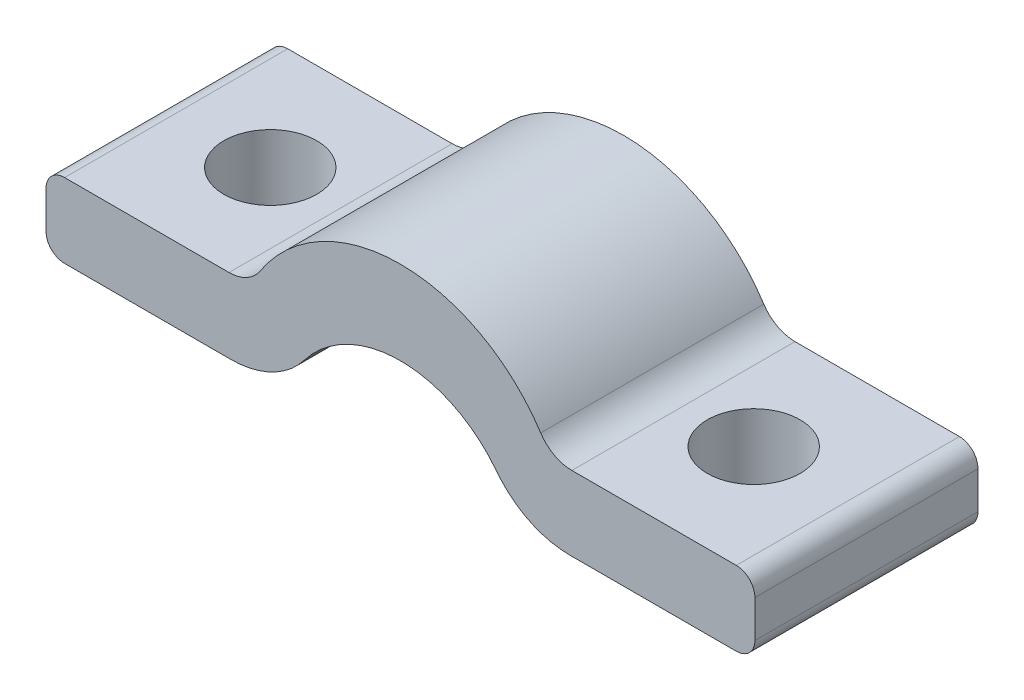
ISO-10303-21;
HEADER;
FILE_DESCRIPTION(('STEP AP214'),'2;1');
FILE_NAME('part.step','',(''),(''),'','','');
FILE_SCHEMA(('AUTOMOTIVE_DESIGN { 1 0 10303 214 1 1 1 1 }'));
ENDSEC;
DATA;
#1=APPLICATION_CONTEXT('core data for automotive mechanical design processes');
#2=APPLICATION_PROTOCOL_DEFINITION('international standard','automotive_design',2000,#1);
#3=PRODUCT_CONTEXT('',#1,'mechanical');
#4=PRODUCT('Part','Part','',(#3));
#5=PRODUCT_RELATED_PRODUCT_CATEGORY('part','',(#4));
#6=PRODUCT_DEFINITION_FORMATION('','',#4);
#7=PRODUCT_DEFINITION_CONTEXT('part definition',#1,'design');
#8=PRODUCT_DEFINITION('design','',#6,#7);
#9=PRODUCT_DEFINITION_SHAPE('','',#8);
#10=(LENGTH_UNIT() NAMED_UNIT(*) SI_UNIT(.MILLI.,.METRE.));
#11=(NAMED_UNIT(*) PLANE_ANGLE_UNIT() SI_UNIT($,.RADIAN.));
#12=(NAMED_UNIT(*) SI_UNIT($,.STERADIAN.) SOLID_ANGLE_UNIT());
#13=UNCERTAINTY_MEASURE_WITH_UNIT(LENGTH_MEASURE(1.E-05),#10,'distance_accuracy_value','');
#14=(GEOMETRIC_REPRESENTATION_CONTEXT(3) GLOBAL_UNCERTAINTY_ASSIGNED_CONTEXT((#13)) GLOBAL_UNIT_ASSIGNED_CONTEXT((#10,
#11,#12)) REPRESENTATION_CONTEXT('',''));
#15=CARTESIAN_POINT('',(0.,0.,0.));
#16=DIRECTION('',(0.,0.,1.));
#17=DIRECTION('',(1.,0.,0.));
#18=AXIS2_PLACEMENT_3D('',#15,#16,#17);
#19=CARTESIAN_POINT('',(0.,0.,6.));
#20=DIRECTION('',(0.,0.,-1.));
#21=DIRECTION('',(-1.,0.,0.));
#22=AXIS2_PLACEMENT_3D('',#19,#20,#21);
#23=CYLINDRICAL_SURFACE('',#22,3.25);
#24=CARTESIAN_POINT('',(0.,0.,0.));
#25=DIRECTION('',(0.,0.,-1.));
#26=DIRECTION('',(-1.,0.,0.));
#27=AXIS2_PLACEMENT_3D('',#24,#25,#26);
#28=CIRCLE('',#27,3.25);
#29=CARTESIAN_POINT('',(-2.57856237697424,1.97826086956522,0.));
#30=VERTEX_POINT('',#29);
#31=CARTESIAN_POINT('',(2.57856237697425,1.97826086956522,0.));
#32=VERTEX_POINT('',#31);
#33=EDGE_CURVE('E271',#30,#32,#28,.T.);
#34=ORIENTED_EDGE('',*,*,#33,.T.);
#35=DIRECTION('',(0.,0.,-1.));
#36=VECTOR('',#35,1.);
#37=CARTESIAN_POINT('',(2.57856237697425,1.97826086956522,6.));
#38=LINE('',#37,#36);
#39=CARTESIAN_POINT('',(2.57856237697425,1.97826086956522,6.));
#40=VERTEX_POINT('',#39);
#41=EDGE_CURVE('E55',#32,#40,#38,.F.);
#42=ORIENTED_EDGE('',*,*,#41,.T.);
#43=CARTESIAN_POINT('',(0.,0.,6.));
#44=DIRECTION('',(0.,0.,-1.));
#45=DIRECTION('',(-1.,0.,0.));
#46=AXIS2_PLACEMENT_3D('',#43,#44,#45);
#47=CIRCLE('',#46,3.25);
#48=CARTESIAN_POINT('',(-2.57856237697424,1.97826086956522,6.));
#49=VERTEX_POINT('',#48);
#50=EDGE_CURVE('E191',#49,#40,#47,.T.);
#51=ORIENTED_EDGE('',*,*,#50,.F.);
#52=DIRECTION('',(0.,0.,-1.));
#53=VECTOR('',#52,1.);
#54=CARTESIAN_POINT('',(-2.57856237697425,1.97826086956522,6.));
#55=LINE('',#54,#53);
#56=EDGE_CURVE('E251',#49,#30,#55,.T.);
#57=ORIENTED_EDGE('',*,*,#56,.T.);
#58=EDGE_LOOP('',(#34,#42,#51,#57));
#59=FACE_BOUND('',#58,.T.);
#60=ADVANCED_FACE('F34',(#59),#23,.F.);
#61=CARTESIAN_POINT('',(3.09232921921325,1.,6.));
#62=DIRECTION('',(0.,1.,0.));
#63=DIRECTION('',(0.,0.,1.));
#64=AXIS2_PLACEMENT_3D('',#61,#62,#63);
#65=PLANE('',#64);
#66=CARTESIAN_POINT('',(6.5,1.,3.));
#67=DIRECTION('',(0.,1.,0.));
#68=DIRECTION('',(0.,0.,1.));
#69=AXIS2_PLACEMENT_3D('',#66,#67,#68);
#70=CIRCLE('',#69,1.25);
#71=CARTESIAN_POINT('',(6.5,1.,4.25));
#72=VERTEX_POINT('',#71);
#73=EDGE_CURVE('E195',#72,#72,#70,.T.);
#74=ORIENTED_EDGE('',*,*,#73,.T.);
#75=EDGE_LOOP('',(#74));
#76=FACE_BOUND('',#75,.T.);
#77=DIRECTION('',(1.,0.,0.));
#78=VECTOR('',#77,1.);
#79=CARTESIAN_POINT('',(3.09232921921325,1.,6.));
#80=LINE('',#79,#78);
#81=CARTESIAN_POINT('',(4.56207189772366,1.,6.));
#82=VERTEX_POINT('',#81);
#83=CARTESIAN_POINT('',(9.03112887414927,1.,6.));
#84=VERTEX_POINT('',#83);
#85=EDGE_CURVE('E260',#82,#84,#80,.T.);
#86=ORIENTED_EDGE('',*,*,#85,.F.);
#87=DIRECTION('',(0.,0.,-1.));
#88=VECTOR('',#87,1.);
#89=CARTESIAN_POINT('',(4.56207189772366,1.,6.));
#90=LINE('',#89,#88);
#91=CARTESIAN_POINT('',(4.56207189772366,1.,0.));
#92=VERTEX_POINT('',#91);
#93=EDGE_CURVE('E244',#82,#92,#90,.T.);
#94=ORIENTED_EDGE('',*,*,#93,.T.);
#95=DIRECTION('',(1.,0.,0.));
#96=VECTOR('',#95,1.);
#97=CARTESIAN_POINT('',(3.09232921921325,1.,0.));
#98=LINE('',#97,#96);
#99=CARTESIAN_POINT('',(9.03112887414927,1.,0.));
#100=VERTEX_POINT('',#99);
#101=EDGE_CURVE('E272',#92,#100,#98,.T.);
#102=ORIENTED_EDGE('',*,*,#101,.T.);
#103=DIRECTION('',(0.,0.,-1.));
#104=VECTOR('',#103,1.);
#105=CARTESIAN_POINT('',(9.03112887414927,1.,6.));
#106=LINE('',#105,#104);
#107=EDGE_CURVE('E220',#100,#84,#106,.F.);
#108=ORIENTED_EDGE('',*,*,#107,.T.);
#109=EDGE_LOOP('',(#86,#94,#102,#108));
#110=FACE_BOUND('',#109,.T.);
#111=ADVANCED_FACE('F264',(#76,#110),#65,.F.);
#112=CARTESIAN_POINT('',(9.53112887414927,1.,6.));
#113=DIRECTION('',(-1.,0.,0.));
#114=DIRECTION('',(0.,0.,1.));
#115=AXIS2_PLACEMENT_3D('',#112,#113,#114);
#116=PLANE('',#115);
#117=DIRECTION('',(0.,1.,0.));
#118=VECTOR('',#117,1.);
#119=CARTESIAN_POINT('',(9.53112887414927,1.,6.));
#120=LINE('',#119,#118);
#121=CARTESIAN_POINT('',(9.53112887414927,1.5,6.));
#122=VERTEX_POINT('',#121);
#123=CARTESIAN_POINT('',(9.53112887414927,2.5,6.));
#124=VERTEX_POINT('',#123);
#125=EDGE_CURVE('E267',#122,#124,#120,.T.);
#126=ORIENTED_EDGE('',*,*,#125,.F.);
#127=DIRECTION('',(0.,0.,-1.));
#128=VECTOR('',#127,1.);
#129=CARTESIAN_POINT('',(9.53112887414927,1.5,6.));
#130=LINE('',#129,#128);
#131=CARTESIAN_POINT('',(9.53112887414927,1.5,0.));
#132=VERTEX_POINT('',#131);
#133=EDGE_CURVE('E208',#122,#132,#130,.T.);
#134=ORIENTED_EDGE('',*,*,#133,.T.);
#135=DIRECTION('',(0.,1.,0.));
#136=VECTOR('',#135,1.);
#137=CARTESIAN_POINT('',(9.53112887414927,1.,0.));
#138=LINE('',#137,#136);
#139=CARTESIAN_POINT('',(9.53112887414927,2.5,0.));
#140=VERTEX_POINT('',#139);
#141=EDGE_CURVE('E183',#132,#140,#138,.T.);
#142=ORIENTED_EDGE('',*,*,#141,.T.);
#143=DIRECTION('',(0.,0.,-1.));
#144=VECTOR('',#143,1.);
#145=CARTESIAN_POINT('',(9.53112887414927,2.5,6.));
#146=LINE('',#145,#144);
#147=EDGE_CURVE('E206',#140,#124,#146,.F.);
#148=ORIENTED_EDGE('',*,*,#147,.T.);
#149=EDGE_LOOP('',(#126,#134,#142,#148));
#150=FACE_BOUND('',#149,.T.);
#151=ADVANCED_FACE('F285',(#150),#116,.F.);
#152=CARTESIAN_POINT('',(9.53112887414927,3.,6.));
#153=DIRECTION('',(0.,-1.,0.));
#154=DIRECTION('',(1.,0.,0.));
#155=AXIS2_PLACEMENT_3D('',#152,#153,#154);
#156=PLANE('',#155);
#157=CARTESIAN_POINT('',(6.5,3.,3.));
#158=DIRECTION('',(0.,1.,0.));
#159=DIRECTION('',(0.,0.,1.));
#160=AXIS2_PLACEMENT_3D('',#157,#158,#159);
#161=CIRCLE('',#160,1.25);
#162=CARTESIAN_POINT('',(6.5,3.,4.25));
#163=VERTEX_POINT('',#162);
#164=EDGE_CURVE('E379',#163,#163,#161,.T.);
#165=ORIENTED_EDGE('',*,*,#164,.F.);
#166=EDGE_LOOP('',(#165));
#167=FACE_BOUND('',#166,.T.);
#168=DIRECTION('',(-1.,0.,0.));
#169=VECTOR('',#168,1.);
#170=CARTESIAN_POINT('',(9.53112887414927,3.,6.));
#171=LINE('',#170,#169);
#172=CARTESIAN_POINT('',(9.03112887414927,3.,6.));
#173=VERTEX_POINT('',#172);
#174=CARTESIAN_POINT('',(4.60977222864644,3.,6.));
#175=VERTEX_POINT('',#174);
#176=EDGE_CURVE('E293',#173,#175,#171,.T.);
#177=ORIENTED_EDGE('',*,*,#176,.F.);
#178=DIRECTION('',(0.,0.,-1.));
#179=VECTOR('',#178,1.);
#180=CARTESIAN_POINT('',(9.03112887414927,3.,6.));
#181=LINE('',#180,#179);
#182=CARTESIAN_POINT('',(9.03112887414927,3.,0.));
#183=VERTEX_POINT('',#182);
#184=EDGE_CURVE('E231',#173,#183,#181,.T.);
#185=ORIENTED_EDGE('',*,*,#184,.T.);
#186=DIRECTION('',(-1.,0.,0.));
#187=VECTOR('',#186,1.);
#188=CARTESIAN_POINT('',(9.53112887414927,3.,0.));
#189=LINE('',#188,#187);
#190=CARTESIAN_POINT('',(4.60977222864644,3.,0.));
#191=VERTEX_POINT('',#190);
#192=EDGE_CURVE('E178',#183,#191,#189,.T.);
#193=ORIENTED_EDGE('',*,*,#192,.T.);
#194=DIRECTION('',(0.,0.,1.));
#195=VECTOR('',#194,1.);
#196=CARTESIAN_POINT('',(4.60977222864644,3.,6.));
#197=LINE('',#196,#195);
#198=EDGE_CURVE('E156',#191,#175,#197,.T.);
#199=ORIENTED_EDGE('',*,*,#198,.T.);
#200=EDGE_LOOP('',(#177,#185,#193,#199));
#201=FACE_BOUND('',#200,.T.);
#202=ADVANCED_FACE('F295',(#167,#201),#156,.F.);
#203=CARTESIAN_POINT('',(0.,1.,6.));
#204=DIRECTION('',(0.,0.,-1.));
#205=DIRECTION('',(-1.,0.,0.));
#206=AXIS2_PLACEMENT_3D('',#203,#204,#205);
#207=CYLINDRICAL_SURFACE('',#206,4.5);
#208=CARTESIAN_POINT('',(0.,1.,6.));
#209=DIRECTION('',(0.,0.,1.));
#210=DIRECTION('',(-1.,0.,0.));
#211=AXIS2_PLACEMENT_3D('',#208,#209,#210);
#212=CIRCLE('',#211,4.5);
#213=CARTESIAN_POINT('',(3.771631823438,3.45454545454545,6.));
#214=VERTEX_POINT('',#213);
#215=CARTESIAN_POINT('',(-3.771631823438,3.45454545454545,6.));
#216=VERTEX_POINT('',#215);
#217=EDGE_CURVE('E170',#214,#216,#212,.T.);
#218=ORIENTED_EDGE('',*,*,#217,.F.);
#219=DIRECTION('',(0.,0.,-1.));
#220=VECTOR('',#219,1.);
#221=CARTESIAN_POINT('',(3.771631823438,3.45454545454545,6.));
#222=LINE('',#221,#220);
#223=CARTESIAN_POINT('',(3.771631823438,3.45454545454545,0.));
#224=VERTEX_POINT('',#223);
#225=EDGE_CURVE('E154',#214,#224,#222,.T.);
#226=ORIENTED_EDGE('',*,*,#225,.T.);
#227=CARTESIAN_POINT('',(0.,1.,0.));
#228=DIRECTION('',(0.,0.,1.));
#229=DIRECTION('',(-1.,0.,0.));
#230=AXIS2_PLACEMENT_3D('',#227,#228,#229);
#231=CIRCLE('',#230,4.5);
#232=CARTESIAN_POINT('',(-3.771631823438,3.45454545454545,0.));
#233=VERTEX_POINT('',#232);
#234=EDGE_CURVE('E167',#224,#233,#231,.T.);
#235=ORIENTED_EDGE('',*,*,#234,.T.);
#236=DIRECTION('',(0.,0.,-1.));
#237=VECTOR('',#236,1.);
#238=CARTESIAN_POINT('',(-3.771631823438,3.45454545454545,6.));
#239=LINE('',#238,#237);
#240=EDGE_CURVE('E171',#233,#216,#239,.F.);
#241=ORIENTED_EDGE('',*,*,#240,.T.);
#242=EDGE_LOOP('',(#218,#226,#235,#241));
#243=FACE_BOUND('',#242,.T.);
#244=ADVANCED_FACE('F166',(#243),#207,.T.);
#245=CARTESIAN_POINT('',(-9.53112887414927,3.,6.));
#246=DIRECTION('',(0.,-1.,0.));
#247=DIRECTION('',(0.,0.,-1.));
#248=AXIS2_PLACEMENT_3D('',#245,#246,#247);
#249=PLANE('',#248);
#250=CARTESIAN_POINT('',(-6.5,3.,3.));
#251=DIRECTION('',(0.,1.,0.));
#252=DIRECTION('',(0.,0.,1.));
#253=AXIS2_PLACEMENT_3D('',#250,#251,#252);
#254=CIRCLE('',#253,1.25);
#255=CARTESIAN_POINT('',(-6.5,3.,4.25));
#256=VERTEX_POINT('',#255);
#257=EDGE_CURVE('E196',#256,#256,#254,.T.);
#258=ORIENTED_EDGE('',*,*,#257,.F.);
#259=EDGE_LOOP('',(#258));
#260=FACE_BOUND('',#259,.T.);
#261=DIRECTION('',(-1.,0.,0.));
#262=VECTOR('',#261,1.);
#263=CARTESIAN_POINT('',(-9.53112887414927,3.,0.));
#264=LINE('',#263,#262);
#265=CARTESIAN_POINT('',(-4.60977222864644,3.,0.));
#266=VERTEX_POINT('',#265);
#267=CARTESIAN_POINT('',(-9.03112887414927,3.,0.));
#268=VERTEX_POINT('',#267);
#269=EDGE_CURVE('E177',#266,#268,#264,.T.);
#270=ORIENTED_EDGE('',*,*,#269,.T.);
#271=DIRECTION('',(0.,0.,-1.));
#272=VECTOR('',#271,1.);
#273=CARTESIAN_POINT('',(-9.03112887414927,3.,6.));
#274=LINE('',#273,#272);
#275=CARTESIAN_POINT('',(-9.03112887414927,3.,6.));
#276=VERTEX_POINT('',#275);
#277=EDGE_CURVE('E242',#268,#276,#274,.F.);
#278=ORIENTED_EDGE('',*,*,#277,.T.);
#279=DIRECTION('',(-1.,0.,0.));
#280=VECTOR('',#279,1.);
#281=CARTESIAN_POINT('',(-9.53112887414927,3.,6.));
#282=LINE('',#281,#280);
#283=CARTESIAN_POINT('',(-4.60977222864644,3.,6.));
#284=VERTEX_POINT('',#283);
#285=EDGE_CURVE('E297',#284,#276,#282,.T.);
#286=ORIENTED_EDGE('',*,*,#285,.F.);
#287=DIRECTION('',(0.,0.,1.));
#288=VECTOR('',#287,1.);
#289=CARTESIAN_POINT('',(-4.60977222864644,3.,0.));
#290=LINE('',#289,#288);
#291=EDGE_CURVE('E161',#284,#266,#290,.F.);
#292=ORIENTED_EDGE('',*,*,#291,.T.);
#293=EDGE_LOOP('',(#270,#278,#286,#292));
#294=FACE_BOUND('',#293,.T.);
#295=ADVANCED_FACE('F323',(#260,#294),#249,.F.);
#296=CARTESIAN_POINT('',(-9.53112887414927,0.999999999999998,6.));
#297=DIRECTION('',(1.,0.,0.));
#298=DIRECTION('',(0.,0.,-1.));
#299=AXIS2_PLACEMENT_3D('',#296,#297,#298);
#300=PLANE('',#299);
#301=DIRECTION('',(0.,-1.,0.));
#302=VECTOR('',#301,1.);
#303=CARTESIAN_POINT('',(-9.53112887414927,0.999999999999998,0.));
#304=LINE('',#303,#302);
#305=CARTESIAN_POINT('',(-9.53112887414927,2.5,0.));
#306=VERTEX_POINT('',#305);
#307=CARTESIAN_POINT('',(-9.53112887414927,1.5,0.));
#308=VERTEX_POINT('',#307);
#309=EDGE_CURVE('E181',#306,#308,#304,.T.);
#310=ORIENTED_EDGE('',*,*,#309,.T.);
#311=DIRECTION('',(0.,0.,-1.));
#312=VECTOR('',#311,1.);
#313=CARTESIAN_POINT('',(-9.53112887414927,1.5,6.));
#314=LINE('',#313,#312);
#315=CARTESIAN_POINT('',(-9.53112887414927,1.5,6.));
#316=VERTEX_POINT('',#315);
#317=EDGE_CURVE('E240',#308,#316,#314,.F.);
#318=ORIENTED_EDGE('',*,*,#317,.T.);
#319=DIRECTION('',(0.,-1.,0.));
#320=VECTOR('',#319,1.);
#321=CARTESIAN_POINT('',(-9.53112887414927,0.999999999999998,6.));
#322=LINE('',#321,#320);
#323=CARTESIAN_POINT('',(-9.53112887414927,2.5,6.));
#324=VERTEX_POINT('',#323);
#325=EDGE_CURVE('E302',#324,#316,#322,.T.);
#326=ORIENTED_EDGE('',*,*,#325,.F.);
#327=DIRECTION('',(0.,0.,-1.));
#328=VECTOR('',#327,1.);
#329=CARTESIAN_POINT('',(-9.53112887414927,2.5,6.));
#330=LINE('',#329,#328);
#331=EDGE_CURVE('E237',#324,#306,#330,.T.);
#332=ORIENTED_EDGE('',*,*,#331,.T.);
#333=EDGE_LOOP('',(#310,#318,#326,#332));
#334=FACE_BOUND('',#333,.T.);
#335=ADVANCED_FACE('F316',(#334),#300,.F.);
#336=CARTESIAN_POINT('',(-3.09232921921325,1.,6.));
#337=DIRECTION('',(0.,1.,0.));
#338=DIRECTION('',(-1.,0.,0.));
#339=AXIS2_PLACEMENT_3D('',#336,#337,#338);
#340=PLANE('',#339);
#341=CARTESIAN_POINT('',(-6.5,0.999999999999998,3.));
#342=DIRECTION('',(0.,1.,0.));
#343=DIRECTION('',(-1.,0.,0.));
#344=AXIS2_PLACEMENT_3D('',#341,#342,#343);
#345=CIRCLE('',#344,1.25);
#346=CARTESIAN_POINT('',(-7.75,0.999999999999998,3.));
#347=VERTEX_POINT('',#346);
#348=EDGE_CURVE('E192',#347,#347,#345,.T.);
#349=ORIENTED_EDGE('',*,*,#348,.T.);
#350=EDGE_LOOP('',(#349));
#351=FACE_BOUND('',#350,.T.);
#352=DIRECTION('',(1.,0.,0.));
#353=VECTOR('',#352,1.);
#354=CARTESIAN_POINT('',(-3.09232921921325,1.,0.));
#355=LINE('',#354,#353);
#356=CARTESIAN_POINT('',(-9.03112887414927,0.999999999999999,0.));
#357=VERTEX_POINT('',#356);
#358=CARTESIAN_POINT('',(-4.56207189772366,1.,0.));
#359=VERTEX_POINT('',#358);
#360=EDGE_CURVE('E189',#357,#359,#355,.T.);
#361=ORIENTED_EDGE('',*,*,#360,.T.);
#362=DIRECTION('',(0.,0.,-1.));
#363=VECTOR('',#362,1.);
#364=CARTESIAN_POINT('',(-4.56207189772366,1.,6.));
#365=LINE('',#364,#363);
#366=CARTESIAN_POINT('',(-4.56207189772366,1.,6.));
#367=VERTEX_POINT('',#366);
#368=EDGE_CURVE('E11',#359,#367,#365,.F.);
#369=ORIENTED_EDGE('',*,*,#368,.T.);
#370=DIRECTION('',(1.,0.,0.));
#371=VECTOR('',#370,1.);
#372=CARTESIAN_POINT('',(-3.09232921921325,1.,6.));
#373=LINE('',#372,#371);
#374=CARTESIAN_POINT('',(-9.03112887414927,0.999999999999999,6.));
#375=VERTEX_POINT('',#374);
#376=EDGE_CURVE('E197',#375,#367,#373,.T.);
#377=ORIENTED_EDGE('',*,*,#376,.F.);
#378=DIRECTION('',(0.,0.,-1.));
#379=VECTOR('',#378,1.);
#380=CARTESIAN_POINT('',(-9.03112887414927,0.999999999999999,6.));
#381=LINE('',#380,#379);
#382=EDGE_CURVE('E234',#375,#357,#381,.T.);
#383=ORIENTED_EDGE('',*,*,#382,.T.);
#384=EDGE_LOOP('',(#361,#369,#377,#383));
#385=FACE_BOUND('',#384,.T.);
#386=ADVANCED_FACE('F310',(#351,#385),#340,.F.);
#387=CARTESIAN_POINT('',(0.,0.,6.));
#388=DIRECTION('',(0.,0.,-1.));
#389=DIRECTION('',(-1.,0.,0.));
#390=AXIS2_PLACEMENT_3D('',#387,#388,#389);
#391=PLANE('',#390);
#392=ORIENTED_EDGE('',*,*,#50,.T.);
#393=CARTESIAN_POINT('',(4.56207189772366,3.5,6.));
#394=DIRECTION('',(0.,0.,-1.));
#395=DIRECTION('',(-1.,0.,0.));
#396=AXIS2_PLACEMENT_3D('',#393,#394,#395);
#397=CIRCLE('',#396,2.5);
#398=EDGE_CURVE('E42',#40,#82,#397,.F.);
#399=ORIENTED_EDGE('',*,*,#398,.T.);
#400=ORIENTED_EDGE('',*,*,#85,.T.);
#401=CARTESIAN_POINT('',(9.03112887414927,1.5,6.));
#402=DIRECTION('',(0.,0.,-1.));
#403=DIRECTION('',(-1.,0.,0.));
#404=AXIS2_PLACEMENT_3D('',#401,#402,#403);
#405=CIRCLE('',#404,0.5);
#406=EDGE_CURVE('E229',#84,#122,#405,.F.);
#407=ORIENTED_EDGE('',*,*,#406,.T.);
#408=ORIENTED_EDGE('',*,*,#125,.T.);
#409=CARTESIAN_POINT('',(9.03112887414927,2.5,6.));
#410=DIRECTION('',(0.,0.,-1.));
#411=DIRECTION('',(-1.,0.,0.));
#412=AXIS2_PLACEMENT_3D('',#409,#410,#411);
#413=CIRCLE('',#412,0.5);
#414=EDGE_CURVE('E227',#124,#173,#413,.F.);
#415=ORIENTED_EDGE('',*,*,#414,.T.);
#416=ORIENTED_EDGE('',*,*,#176,.T.);
#417=CARTESIAN_POINT('',(4.60977222864644,4.,6.));
#418=DIRECTION('',(0.,0.,-1.));
#419=DIRECTION('',(-1.,0.,0.));
#420=AXIS2_PLACEMENT_3D('',#417,#418,#419);
#421=CIRCLE('',#420,1.);
#422=EDGE_CURVE('E160',#175,#214,#421,.T.);
#423=ORIENTED_EDGE('',*,*,#422,.T.);
#424=ORIENTED_EDGE('',*,*,#217,.T.);
#425=CARTESIAN_POINT('',(-4.60977222864644,4.,6.));
#426=DIRECTION('',(0.,0.,-1.));
#427=DIRECTION('',(-1.,0.,0.));
#428=AXIS2_PLACEMENT_3D('',#425,#426,#427);
#429=CIRCLE('',#428,1.);
#430=EDGE_CURVE('E204',#216,#284,#429,.T.);
#431=ORIENTED_EDGE('',*,*,#430,.T.);
#432=ORIENTED_EDGE('',*,*,#285,.T.);
#433=CARTESIAN_POINT('',(-9.03112887414927,2.5,6.));
#434=DIRECTION('',(0.,0.,-1.));
#435=DIRECTION('',(-1.,0.,0.));
#436=AXIS2_PLACEMENT_3D('',#433,#434,#435);
#437=CIRCLE('',#436,0.5);
#438=EDGE_CURVE('E223',#276,#324,#437,.F.);
#439=ORIENTED_EDGE('',*,*,#438,.T.);
#440=ORIENTED_EDGE('',*,*,#325,.T.);
#441=CARTESIAN_POINT('',(-9.03112887414927,1.5,6.));
#442=DIRECTION('',(0.,0.,-1.));
#443=DIRECTION('',(-1.,0.,0.));
#444=AXIS2_PLACEMENT_3D('',#441,#442,#443);
#445=CIRCLE('',#444,0.5);
#446=EDGE_CURVE('E225',#316,#375,#445,.F.);
#447=ORIENTED_EDGE('',*,*,#446,.T.);
#448=ORIENTED_EDGE('',*,*,#376,.T.);
#449=CARTESIAN_POINT('',(-4.56207189772366,3.5,6.));
#450=DIRECTION('',(0.,0.,-1.));
#451=DIRECTION('',(-1.,0.,0.));
#452=AXIS2_PLACEMENT_3D('',#449,#450,#451);
#453=CIRCLE('',#452,2.5);
#454=EDGE_CURVE('E255',#367,#49,#453,.F.);
#455=ORIENTED_EDGE('',*,*,#454,.T.);
#456=EDGE_LOOP('',(#392,#399,#400,#407,#408,#415,#416,#423,#424,#431,#432,#439,#440,#447,#448,#455));
#457=FACE_BOUND('',#456,.T.);
#458=ADVANCED_FACE('F259',(#457),#391,.F.);
#459=CARTESIAN_POINT('',(0.,0.,0.));
#460=DIRECTION('',(0.,0.,-1.));
#461=DIRECTION('',(-1.,0.,0.));
#462=AXIS2_PLACEMENT_3D('',#459,#460,#461);
#463=PLANE('',#462);
#464=ORIENTED_EDGE('',*,*,#101,.F.);
#465=CARTESIAN_POINT('',(4.56207189772366,3.5,0.));
#466=DIRECTION('',(0.,0.,-1.));
#467=DIRECTION('',(-1.,0.,0.));
#468=AXIS2_PLACEMENT_3D('',#465,#466,#467);
#469=CIRCLE('',#468,2.5);
#470=EDGE_CURVE('E249',#92,#32,#469,.T.);
#471=ORIENTED_EDGE('',*,*,#470,.T.);
#472=ORIENTED_EDGE('',*,*,#33,.F.);
#473=CARTESIAN_POINT('',(-4.56207189772366,3.5,0.));
#474=DIRECTION('',(0.,0.,-1.));
#475=DIRECTION('',(-1.,0.,0.));
#476=AXIS2_PLACEMENT_3D('',#473,#474,#475);
#477=CIRCLE('',#476,2.5);
#478=EDGE_CURVE('E247',#30,#359,#477,.T.);
#479=ORIENTED_EDGE('',*,*,#478,.T.);
#480=ORIENTED_EDGE('',*,*,#360,.F.);
#481=CARTESIAN_POINT('',(-9.03112887414927,1.5,0.));
#482=DIRECTION('',(0.,0.,-1.));
#483=DIRECTION('',(-1.,0.,0.));
#484=AXIS2_PLACEMENT_3D('',#481,#482,#483);
#485=CIRCLE('',#484,0.5);
#486=EDGE_CURVE('E213',#357,#308,#485,.T.);
#487=ORIENTED_EDGE('',*,*,#486,.T.);
#488=ORIENTED_EDGE('',*,*,#309,.F.);
#489=CARTESIAN_POINT('',(-9.03112887414927,2.5,0.));
#490=DIRECTION('',(0.,0.,-1.));
#491=DIRECTION('',(-1.,0.,0.));
#492=AXIS2_PLACEMENT_3D('',#489,#490,#491);
#493=CIRCLE('',#492,0.5);
#494=EDGE_CURVE('E211',#306,#268,#493,.T.);
#495=ORIENTED_EDGE('',*,*,#494,.T.);
#496=ORIENTED_EDGE('',*,*,#269,.F.);
#497=CARTESIAN_POINT('',(-4.60977222864644,4.,0.));
#498=DIRECTION('',(0.,0.,-1.));
#499=DIRECTION('',(-1.,0.,0.));
#500=AXIS2_PLACEMENT_3D('',#497,#498,#499);
#501=CIRCLE('',#500,1.);
#502=EDGE_CURVE('E176',#266,#233,#501,.F.);
#503=ORIENTED_EDGE('',*,*,#502,.T.);
#504=ORIENTED_EDGE('',*,*,#234,.F.);
#505=CARTESIAN_POINT('',(4.60977222864644,4.,0.));
#506=DIRECTION('',(0.,0.,-1.));
#507=DIRECTION('',(-1.,0.,0.));
#508=AXIS2_PLACEMENT_3D('',#505,#506,#507);
#509=CIRCLE('',#508,1.);
#510=EDGE_CURVE('E150',#224,#191,#509,.F.);
#511=ORIENTED_EDGE('',*,*,#510,.T.);
#512=ORIENTED_EDGE('',*,*,#192,.F.);
#513=CARTESIAN_POINT('',(9.03112887414927,2.5,0.));
#514=DIRECTION('',(0.,0.,-1.));
#515=DIRECTION('',(-1.,0.,0.));
#516=AXIS2_PLACEMENT_3D('',#513,#514,#515);
#517=CIRCLE('',#516,0.5);
#518=EDGE_CURVE('E215',#183,#140,#517,.T.);
#519=ORIENTED_EDGE('',*,*,#518,.T.);
#520=ORIENTED_EDGE('',*,*,#141,.F.);
#521=CARTESIAN_POINT('',(9.03112887414927,1.5,0.));
#522=DIRECTION('',(0.,0.,-1.));
#523=DIRECTION('',(-1.,0.,0.));
#524=AXIS2_PLACEMENT_3D('',#521,#522,#523);
#525=CIRCLE('',#524,0.5);
#526=EDGE_CURVE('E217',#132,#100,#525,.T.);
#527=ORIENTED_EDGE('',*,*,#526,.T.);
#528=EDGE_LOOP('',(#464,#471,#472,#479,#480,#487,#488,#495,#496,#503,#504,#511,#512,#519,#520,#527));
#529=FACE_BOUND('',#528,.T.);
#530=ADVANCED_FACE('F174',(#529),#463,.T.);
#531=CARTESIAN_POINT('',(-6.5,-7.,3.));
#532=DIRECTION('',(0.,1.,0.));
#533=DIRECTION('',(0.,0.,1.));
#534=AXIS2_PLACEMENT_3D('',#531,#532,#533);
#535=CYLINDRICAL_SURFACE('',#534,1.25);
#536=ORIENTED_EDGE('',*,*,#257,.T.);
#537=EDGE_LOOP('',(#536));
#538=FACE_BOUND('',#537,.T.);
#539=ORIENTED_EDGE('',*,*,#348,.F.);
#540=EDGE_LOOP('',(#539));
#541=FACE_BOUND('',#540,.T.);
#542=ADVANCED_FACE('F365',(#538,#541),#535,.F.);
#543=CARTESIAN_POINT('',(6.5,-7.,3.));
#544=DIRECTION('',(0.,1.,0.));
#545=DIRECTION('',(0.,0.,1.));
#546=AXIS2_PLACEMENT_3D('',#543,#544,#545);
#547=CYLINDRICAL_SURFACE('',#546,1.25);
#548=ORIENTED_EDGE('',*,*,#164,.T.);
#549=EDGE_LOOP('',(#548));
#550=FACE_BOUND('',#549,.T.);
#551=ORIENTED_EDGE('',*,*,#73,.F.);
#552=EDGE_LOOP('',(#551));
#553=FACE_BOUND('',#552,.T.);
#554=ADVANCED_FACE('F338',(#550,#553),#547,.F.);
#555=CARTESIAN_POINT('',(4.60977222864644,4.,6.));
#556=DIRECTION('',(0.,0.,-1.));
#557=DIRECTION('',(-1.,0.,0.));
#558=AXIS2_PLACEMENT_3D('',#555,#556,#557);
#559=CYLINDRICAL_SURFACE('',#558,1.);
#560=ORIENTED_EDGE('',*,*,#422,.F.);
#561=ORIENTED_EDGE('',*,*,#198,.F.);
#562=ORIENTED_EDGE('',*,*,#510,.F.);
#563=ORIENTED_EDGE('',*,*,#225,.F.);
#564=EDGE_LOOP('',(#560,#561,#562,#563));
#565=FACE_BOUND('',#564,.T.);
#566=ADVANCED_FACE('F153',(#565),#559,.F.);
#567=CARTESIAN_POINT('',(-4.60977222864644,4.,6.));
#568=DIRECTION('',(0.,0.,-1.));
#569=DIRECTION('',(-1.,0.,0.));
#570=AXIS2_PLACEMENT_3D('',#567,#568,#569);
#571=CYLINDRICAL_SURFACE('',#570,1.);
#572=ORIENTED_EDGE('',*,*,#430,.F.);
#573=ORIENTED_EDGE('',*,*,#240,.F.);
#574=ORIENTED_EDGE('',*,*,#502,.F.);
#575=ORIENTED_EDGE('',*,*,#291,.F.);
#576=EDGE_LOOP('',(#572,#573,#574,#575));
#577=FACE_BOUND('',#576,.T.);
#578=ADVANCED_FACE('F328',(#577),#571,.F.);
#579=CARTESIAN_POINT('',(9.03112887414927,1.5,6.));
#580=DIRECTION('',(0.,0.,-1.));
#581=DIRECTION('',(-1.,0.,0.));
#582=AXIS2_PLACEMENT_3D('',#579,#580,#581);
#583=CYLINDRICAL_SURFACE('',#582,0.5);
#584=ORIENTED_EDGE('',*,*,#406,.F.);
#585=ORIENTED_EDGE('',*,*,#107,.F.);
#586=ORIENTED_EDGE('',*,*,#526,.F.);
#587=ORIENTED_EDGE('',*,*,#133,.F.);
#588=EDGE_LOOP('',(#584,#585,#586,#587));
#589=FACE_BOUND('',#588,.T.);
#590=ADVANCED_FACE('F330',(#589),#583,.T.);
#591=CARTESIAN_POINT('',(9.03112887414927,2.5,6.));
#592=DIRECTION('',(0.,0.,-1.));
#593=DIRECTION('',(-1.,0.,0.));
#594=AXIS2_PLACEMENT_3D('',#591,#592,#593);
#595=CYLINDRICAL_SURFACE('',#594,0.5);
#596=ORIENTED_EDGE('',*,*,#414,.F.);
#597=ORIENTED_EDGE('',*,*,#147,.F.);
#598=ORIENTED_EDGE('',*,*,#518,.F.);
#599=ORIENTED_EDGE('',*,*,#184,.F.);
#600=EDGE_LOOP('',(#596,#597,#598,#599));
#601=FACE_BOUND('',#600,.T.);
#602=ADVANCED_FACE('F290',(#601),#595,.T.);
#603=CARTESIAN_POINT('',(-9.03112887414927,1.5,6.));
#604=DIRECTION('',(0.,0.,-1.));
#605=DIRECTION('',(-1.,0.,0.));
#606=AXIS2_PLACEMENT_3D('',#603,#604,#605);
#607=CYLINDRICAL_SURFACE('',#606,0.5);
#608=ORIENTED_EDGE('',*,*,#446,.F.);
#609=ORIENTED_EDGE('',*,*,#317,.F.);
#610=ORIENTED_EDGE('',*,*,#486,.F.);
#611=ORIENTED_EDGE('',*,*,#382,.F.);
#612=EDGE_LOOP('',(#608,#609,#610,#611));
#613=FACE_BOUND('',#612,.T.);
#614=ADVANCED_FACE('F312',(#613),#607,.T.);
#615=CARTESIAN_POINT('',(-9.03112887414927,2.5,6.));
#616=DIRECTION('',(0.,0.,-1.));
#617=DIRECTION('',(-1.,0.,0.));
#618=AXIS2_PLACEMENT_3D('',#615,#616,#617);
#619=CYLINDRICAL_SURFACE('',#618,0.5);
#620=ORIENTED_EDGE('',*,*,#438,.F.);
#621=ORIENTED_EDGE('',*,*,#277,.F.);
#622=ORIENTED_EDGE('',*,*,#494,.F.);
#623=ORIENTED_EDGE('',*,*,#331,.F.);
#624=EDGE_LOOP('',(#620,#621,#622,#623));
#625=FACE_BOUND('',#624,.T.);
#626=ADVANCED_FACE('F320',(#625),#619,.T.);
#627=CARTESIAN_POINT('',(4.56207189772366,3.5,6.));
#628=DIRECTION('',(0.,0.,-1.));
#629=DIRECTION('',(-1.,0.,0.));
#630=AXIS2_PLACEMENT_3D('',#627,#628,#629);
#631=CYLINDRICAL_SURFACE('',#630,2.5);
#632=ORIENTED_EDGE('',*,*,#398,.F.);
#633=ORIENTED_EDGE('',*,*,#41,.F.);
#634=ORIENTED_EDGE('',*,*,#470,.F.);
#635=ORIENTED_EDGE('',*,*,#93,.F.);
#636=EDGE_LOOP('',(#632,#633,#634,#635));
#637=FACE_BOUND('',#636,.T.);
#638=ADVANCED_FACE('F269',(#637),#631,.T.);
#639=CARTESIAN_POINT('',(-4.56207189772366,3.5,6.));
#640=DIRECTION('',(0.,0.,-1.));
#641=DIRECTION('',(-1.,0.,0.));
#642=AXIS2_PLACEMENT_3D('',#639,#640,#641);
#643=CYLINDRICAL_SURFACE('',#642,2.5);
#644=ORIENTED_EDGE('',*,*,#454,.F.);
#645=ORIENTED_EDGE('',*,*,#368,.F.);
#646=ORIENTED_EDGE('',*,*,#478,.F.);
#647=ORIENTED_EDGE('',*,*,#56,.F.);
#648=EDGE_LOOP('',(#644,#645,#646,#647));
#649=FACE_BOUND('',#648,.T.);
#650=ADVANCED_FACE('F36',(#649),#643,.T.);
#651=CLOSED_SHELL('',(#60,#111,#151,#202,#244,#295,#335,#386,#458,#530,#542,#554,#566,#578,#590,
#602,#614,#626,#638,#650));
#652=MANIFOLD_SOLID_BREP('B2',#651);
#653=ADVANCED_BREP_SHAPE_REPRESENTATION('',(#18,#652),#14);
#654=SHAPE_DEFINITION_REPRESENTATION(#9,#653);
ENDSEC;
END-ISO-10303-21;
